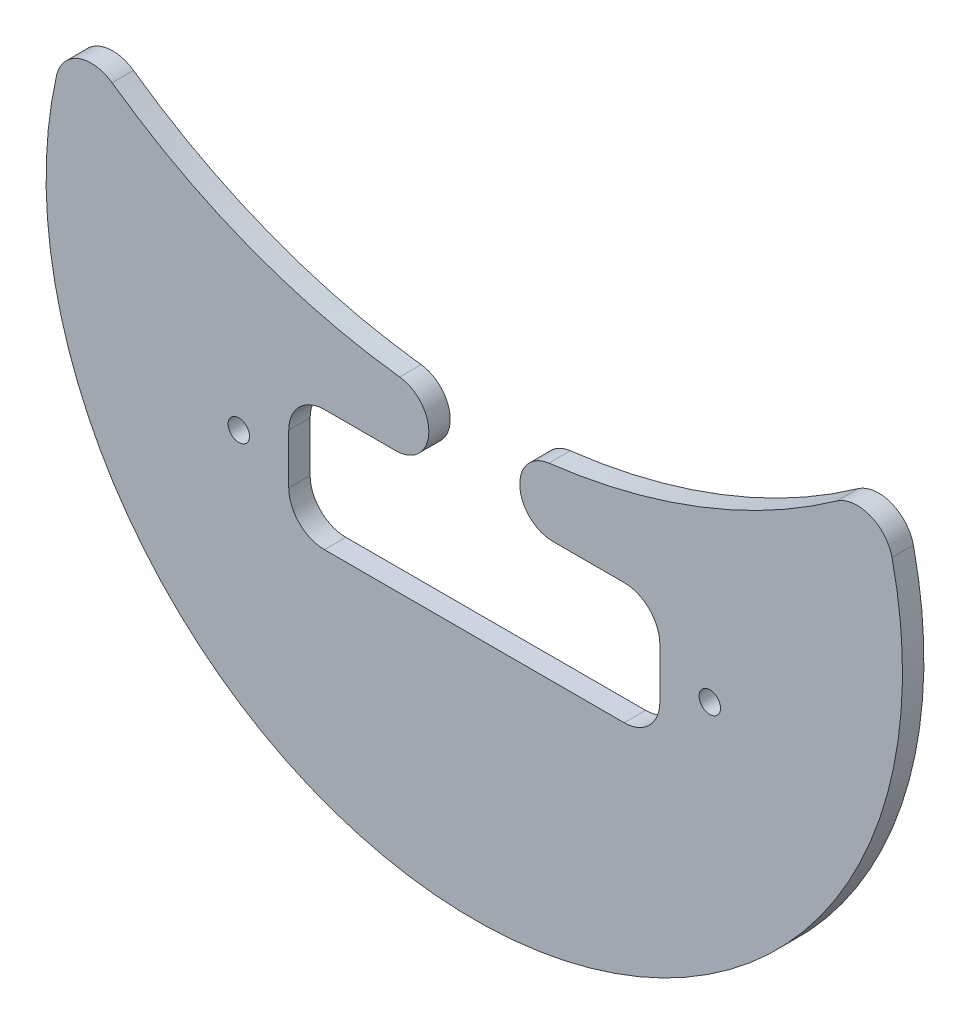
ISO-10303-21;
HEADER;
FILE_DESCRIPTION(('STEP AP214'),'2;1');
FILE_NAME('part.step','',(''),(''),'','','');
FILE_SCHEMA(('AUTOMOTIVE_DESIGN { 1 0 10303 214 1 1 1 1 }'));
ENDSEC;
DATA;
#1=APPLICATION_CONTEXT('core data for automotive mechanical design processes');
#2=APPLICATION_PROTOCOL_DEFINITION('international standard','automotive_design',2000,#1);
#3=PRODUCT_CONTEXT('',#1,'mechanical');
#4=PRODUCT('Part','Part','',(#3));
#5=PRODUCT_RELATED_PRODUCT_CATEGORY('part','',(#4));
#6=PRODUCT_DEFINITION_FORMATION('','',#4);
#7=PRODUCT_DEFINITION_CONTEXT('part definition',#1,'design');
#8=PRODUCT_DEFINITION('design','',#6,#7);
#9=PRODUCT_DEFINITION_SHAPE('','',#8);
#10=(LENGTH_UNIT() NAMED_UNIT(*) SI_UNIT(.MILLI.,.METRE.));
#11=(NAMED_UNIT(*) PLANE_ANGLE_UNIT() SI_UNIT($,.RADIAN.));
#12=(NAMED_UNIT(*) SI_UNIT($,.STERADIAN.) SOLID_ANGLE_UNIT());
#13=UNCERTAINTY_MEASURE_WITH_UNIT(LENGTH_MEASURE(1.E-05),#10,'distance_accuracy_value','');
#14=(GEOMETRIC_REPRESENTATION_CONTEXT(3) GLOBAL_UNCERTAINTY_ASSIGNED_CONTEXT((#13)) GLOBAL_UNIT_ASSIGNED_CONTEXT((#10,
#11,#12)) REPRESENTATION_CONTEXT('',''));
#15=CARTESIAN_POINT('',(0.,0.,0.));
#16=DIRECTION('',(0.,0.,1.));
#17=DIRECTION('',(1.,0.,0.));
#18=AXIS2_PLACEMENT_3D('',#15,#16,#17);
#19=CARTESIAN_POINT('',(0.151407967482101,120.064132004892,3.));
#20=DIRECTION('',(0.,0.,1.));
#21=DIRECTION('',(1.,0.,0.));
#22=AXIS2_PLACEMENT_3D('',#19,#20,#21);
#23=PLANE('',#22);
#24=CARTESIAN_POINT('',(-32.8485920325179,15.25,3.));
#25=DIRECTION('',(0.,0.,1.));
#26=DIRECTION('',(1.,0.,0.));
#27=AXIS2_PLACEMENT_3D('',#24,#25,#26);
#28=CIRCLE('',#27,1.5);
#29=CARTESIAN_POINT('',(-31.3485920325179,15.25,3.));
#30=VERTEX_POINT('',#29);
#31=EDGE_CURVE('E192',#30,#30,#28,.T.);
#32=ORIENTED_EDGE('',*,*,#31,.F.);
#33=EDGE_LOOP('',(#32));
#34=FACE_BOUND('',#33,.T.);
#35=CARTESIAN_POINT('',(0.151407967482101,120.064132004892,3.));
#36=DIRECTION('',(0.,0.,-1.));
#37=DIRECTION('',(1.,0.,0.));
#38=AXIS2_PLACEMENT_3D('',#35,#36,#37);
#39=CIRCLE('',#38,87.7141320048927);
#40=CARTESIAN_POINT('',(-10.2972090877304,32.974549648532,3.));
#41=VERTEX_POINT('',#40);
#42=CARTESIAN_POINT('',(-50.6074334631441,48.528763340208,3.));
#43=VERTEX_POINT('',#42);
#44=EDGE_CURVE('E214',#41,#43,#39,.T.);
#45=ORIENTED_EDGE('',*,*,#44,.T.);
#46=CARTESIAN_POINT('',(-53.5008578333354,44.451007166283,3.));
#47=DIRECTION('',(0.,0.,1.));
#48=DIRECTION('',(1.,0.,0.));
#49=AXIS2_PLACEMENT_3D('',#46,#47,#48);
#50=CIRCLE('',#49,5.);
#51=CARTESIAN_POINT('',(-58.3783365425006,45.5510987268542,3.));
#52=VERTEX_POINT('',#51);
#53=EDGE_CURVE('E251',#43,#52,#50,.T.);
#54=ORIENTED_EDGE('',*,*,#53,.T.);
#55=CARTESIAN_POINT('',(0.151407967482101,32.35,3.));
#56=DIRECTION('',(0.,0.,1.));
#57=DIRECTION('',(1.,0.,0.));
#58=AXIS2_PLACEMENT_3D('',#55,#56,#57);
#59=CIRCLE('',#58,60.);
#60=CARTESIAN_POINT('',(58.6811524774648,45.5510987268542,3.));
#61=VERTEX_POINT('',#60);
#62=EDGE_CURVE('E155',#52,#61,#59,.T.);
#63=ORIENTED_EDGE('',*,*,#62,.T.);
#64=CARTESIAN_POINT('',(53.8036737682996,44.451007166283,3.));
#65=DIRECTION('',(0.,0.,1.));
#66=DIRECTION('',(1.,0.,0.));
#67=AXIS2_PLACEMENT_3D('',#64,#65,#66);
#68=CIRCLE('',#67,5.);
#69=CARTESIAN_POINT('',(50.9102493981083,48.528763340208,3.));
#70=VERTEX_POINT('',#69);
#71=EDGE_CURVE('E48',#61,#70,#68,.T.);
#72=ORIENTED_EDGE('',*,*,#71,.T.);
#73=CARTESIAN_POINT('',(0.151407967482101,120.064132004892,3.));
#74=DIRECTION('',(0.,0.,-1.));
#75=DIRECTION('',(1.,0.,0.));
#76=AXIS2_PLACEMENT_3D('',#73,#74,#75);
#77=CIRCLE('',#76,87.7141320048927);
#78=CARTESIAN_POINT('',(10.6000250226946,32.9745496485319,3.));
#79=VERTEX_POINT('',#78);
#80=EDGE_CURVE('E145',#70,#79,#77,.T.);
#81=ORIENTED_EDGE('',*,*,#80,.T.);
#82=CARTESIAN_POINT('',(11.1514079674821,28.3787538483586,3.));
#83=DIRECTION('',(0.,0.,1.));
#84=DIRECTION('',(1.,0.,0.));
#85=AXIS2_PLACEMENT_3D('',#82,#83,#84);
#86=CIRCLE('',#85,4.62875384835843);
#87=CARTESIAN_POINT('',(11.1514079674821,23.7500000000002,3.));
#88=VERTEX_POINT('',#87);
#89=EDGE_CURVE('E150',#79,#88,#86,.T.);
#90=ORIENTED_EDGE('',*,*,#89,.T.);
#91=DIRECTION('',(1.,0.,0.));
#92=VECTOR('',#91,1.);
#93=CARTESIAN_POINT('',(11.1514079674821,23.75,3.));
#94=LINE('',#93,#92);
#95=CARTESIAN_POINT('',(21.1514079674821,23.75,3.));
#96=VERTEX_POINT('',#95);
#97=EDGE_CURVE('E170',#88,#96,#94,.T.);
#98=ORIENTED_EDGE('',*,*,#97,.T.);
#99=CARTESIAN_POINT('',(21.1514079674821,18.75,3.));
#100=DIRECTION('',(0.,0.,1.));
#101=DIRECTION('',(1.,0.,0.));
#102=AXIS2_PLACEMENT_3D('',#99,#100,#101);
#103=CIRCLE('',#102,5.);
#104=CARTESIAN_POINT('',(26.1514079674821,18.75,3.));
#105=VERTEX_POINT('',#104);
#106=EDGE_CURVE('E11',#96,#105,#103,.F.);
#107=ORIENTED_EDGE('',*,*,#106,.T.);
#108=DIRECTION('',(0.,-1.,0.));
#109=VECTOR('',#108,1.);
#110=CARTESIAN_POINT('',(26.1514079674821,6.74999999999999,3.));
#111=LINE('',#110,#109);
#112=CARTESIAN_POINT('',(26.1514079674821,11.75,3.));
#113=VERTEX_POINT('',#112);
#114=EDGE_CURVE('E172',#105,#113,#111,.T.);
#115=ORIENTED_EDGE('',*,*,#114,.T.);
#116=CARTESIAN_POINT('',(21.1514079674821,11.75,3.));
#117=DIRECTION('',(0.,0.,1.));
#118=DIRECTION('',(1.,0.,0.));
#119=AXIS2_PLACEMENT_3D('',#116,#117,#118);
#120=CIRCLE('',#119,5.);
#121=CARTESIAN_POINT('',(21.1514079674821,6.74999999999999,3.));
#122=VERTEX_POINT('',#121);
#123=EDGE_CURVE('E265',#113,#122,#120,.F.);
#124=ORIENTED_EDGE('',*,*,#123,.T.);
#125=DIRECTION('',(-1.,0.,0.));
#126=VECTOR('',#125,1.);
#127=CARTESIAN_POINT('',(-25.8485920325179,6.74999999999999,3.));
#128=LINE('',#127,#126);
#129=CARTESIAN_POINT('',(-20.8485920325179,6.74999999999999,3.));
#130=VERTEX_POINT('',#129);
#131=EDGE_CURVE('E178',#122,#130,#128,.T.);
#132=ORIENTED_EDGE('',*,*,#131,.T.);
#133=CARTESIAN_POINT('',(-20.8485920325179,11.75,3.));
#134=DIRECTION('',(0.,0.,1.));
#135=DIRECTION('',(1.,0.,0.));
#136=AXIS2_PLACEMENT_3D('',#133,#134,#135);
#137=CIRCLE('',#136,5.);
#138=CARTESIAN_POINT('',(-25.8485920325179,11.75,3.));
#139=VERTEX_POINT('',#138);
#140=EDGE_CURVE('E261',#130,#139,#137,.F.);
#141=ORIENTED_EDGE('',*,*,#140,.T.);
#142=DIRECTION('',(0.,1.,0.));
#143=VECTOR('',#142,1.);
#144=CARTESIAN_POINT('',(-25.8485920325179,6.74999999999999,3.));
#145=LINE('',#144,#143);
#146=CARTESIAN_POINT('',(-25.8485920325179,18.75,3.));
#147=VERTEX_POINT('',#146);
#148=EDGE_CURVE('E181',#139,#147,#145,.T.);
#149=ORIENTED_EDGE('',*,*,#148,.T.);
#150=CARTESIAN_POINT('',(-20.8485920325179,18.75,3.));
#151=DIRECTION('',(0.,0.,1.));
#152=DIRECTION('',(1.,0.,0.));
#153=AXIS2_PLACEMENT_3D('',#150,#151,#152);
#154=CIRCLE('',#153,5.);
#155=CARTESIAN_POINT('',(-20.8485920325179,23.75,3.));
#156=VERTEX_POINT('',#155);
#157=EDGE_CURVE('E257',#147,#156,#154,.F.);
#158=ORIENTED_EDGE('',*,*,#157,.T.);
#159=DIRECTION('',(1.,0.,0.));
#160=VECTOR('',#159,1.);
#161=CARTESIAN_POINT('',(-25.8485920325179,23.75,3.));
#162=LINE('',#161,#160);
#163=CARTESIAN_POINT('',(-10.8485920325179,23.75,3.));
#164=VERTEX_POINT('',#163);
#165=EDGE_CURVE('E184',#156,#164,#162,.T.);
#166=ORIENTED_EDGE('',*,*,#165,.T.);
#167=CARTESIAN_POINT('',(-10.8485920325179,28.3787538483587,3.));
#168=DIRECTION('',(0.,0.,1.));
#169=DIRECTION('',(-1.,0.,0.));
#170=AXIS2_PLACEMENT_3D('',#167,#168,#169);
#171=CIRCLE('',#170,4.62875384835843);
#172=EDGE_CURVE('E186',#164,#41,#171,.T.);
#173=ORIENTED_EDGE('',*,*,#172,.T.);
#174=EDGE_LOOP('',(#45,#54,#63,#72,#81,#90,#98,#107,#115,#124,#132,#141,#149,#158,#166,#173));
#175=FACE_BOUND('',#174,.T.);
#176=CARTESIAN_POINT('',(33.1514079674821,15.25,3.));
#177=DIRECTION('',(0.,0.,1.));
#178=DIRECTION('',(1.,0.,0.));
#179=AXIS2_PLACEMENT_3D('',#176,#177,#178);
#180=CIRCLE('',#179,1.5);
#181=CARTESIAN_POINT('',(34.6514079674821,15.25,3.));
#182=VERTEX_POINT('',#181);
#183=EDGE_CURVE('E330',#182,#182,#180,.T.);
#184=ORIENTED_EDGE('',*,*,#183,.F.);
#185=EDGE_LOOP('',(#184));
#186=FACE_BOUND('',#185,.T.);
#187=ADVANCED_FACE('F33',(#34,#175,#186),#23,.T.);
#188=CARTESIAN_POINT('',(0.151407967482101,120.064132004892,0.));
#189=DIRECTION('',(0.,0.,1.));
#190=DIRECTION('',(1.,0.,0.));
#191=AXIS2_PLACEMENT_3D('',#188,#189,#190);
#192=PLANE('',#191);
#193=CARTESIAN_POINT('',(0.151407967482101,32.35,0.));
#194=DIRECTION('',(0.,0.,1.));
#195=DIRECTION('',(1.,0.,0.));
#196=AXIS2_PLACEMENT_3D('',#193,#194,#195);
#197=CIRCLE('',#196,60.);
#198=CARTESIAN_POINT('',(-58.3783365425006,45.5510987268542,0.));
#199=VERTEX_POINT('',#198);
#200=CARTESIAN_POINT('',(58.6811524774648,45.5510987268542,0.));
#201=VERTEX_POINT('',#200);
#202=EDGE_CURVE('E191',#199,#201,#197,.T.);
#203=ORIENTED_EDGE('',*,*,#202,.F.);
#204=CARTESIAN_POINT('',(-53.5008578333354,44.451007166283,0.));
#205=DIRECTION('',(0.,0.,1.));
#206=DIRECTION('',(1.,0.,0.));
#207=AXIS2_PLACEMENT_3D('',#204,#205,#206);
#208=CIRCLE('',#207,5.);
#209=CARTESIAN_POINT('',(-50.6074334631441,48.528763340208,0.));
#210=VERTEX_POINT('',#209);
#211=EDGE_CURVE('E247',#199,#210,#208,.F.);
#212=ORIENTED_EDGE('',*,*,#211,.T.);
#213=CARTESIAN_POINT('',(0.151407967482101,120.064132004892,0.));
#214=DIRECTION('',(0.,0.,-1.));
#215=DIRECTION('',(1.,0.,0.));
#216=AXIS2_PLACEMENT_3D('',#213,#214,#215);
#217=CIRCLE('',#216,87.7141320048927);
#218=CARTESIAN_POINT('',(-10.2972090877304,32.974549648532,0.));
#219=VERTEX_POINT('',#218);
#220=EDGE_CURVE('E189',#219,#210,#217,.T.);
#221=ORIENTED_EDGE('',*,*,#220,.F.);
#222=CARTESIAN_POINT('',(-10.8485920325179,28.3787538483587,0.));
#223=DIRECTION('',(0.,0.,1.));
#224=DIRECTION('',(-1.,0.,0.));
#225=AXIS2_PLACEMENT_3D('',#222,#223,#224);
#226=CIRCLE('',#225,4.62875384835843);
#227=CARTESIAN_POINT('',(-10.8485920325179,23.75,0.));
#228=VERTEX_POINT('',#227);
#229=EDGE_CURVE('E212',#228,#219,#226,.T.);
#230=ORIENTED_EDGE('',*,*,#229,.F.);
#231=DIRECTION('',(1.,0.,0.));
#232=VECTOR('',#231,1.);
#233=CARTESIAN_POINT('',(-25.8485920325179,23.75,0.));
#234=LINE('',#233,#232);
#235=CARTESIAN_POINT('',(-20.8485920325179,23.75,0.));
#236=VERTEX_POINT('',#235);
#237=EDGE_CURVE('E210',#236,#228,#234,.T.);
#238=ORIENTED_EDGE('',*,*,#237,.F.);
#239=CARTESIAN_POINT('',(-20.8485920325179,18.75,0.));
#240=DIRECTION('',(0.,0.,1.));
#241=DIRECTION('',(1.,0.,0.));
#242=AXIS2_PLACEMENT_3D('',#239,#240,#241);
#243=CIRCLE('',#242,5.);
#244=CARTESIAN_POINT('',(-25.8485920325179,18.75,0.));
#245=VERTEX_POINT('',#244);
#246=EDGE_CURVE('E255',#236,#245,#243,.T.);
#247=ORIENTED_EDGE('',*,*,#246,.T.);
#248=DIRECTION('',(0.,1.,0.));
#249=VECTOR('',#248,1.);
#250=CARTESIAN_POINT('',(-25.8485920325179,6.74999999999999,0.));
#251=LINE('',#250,#249);
#252=CARTESIAN_POINT('',(-25.8485920325179,11.75,0.));
#253=VERTEX_POINT('',#252);
#254=EDGE_CURVE('E207',#253,#245,#251,.T.);
#255=ORIENTED_EDGE('',*,*,#254,.F.);
#256=CARTESIAN_POINT('',(-20.8485920325179,11.75,0.));
#257=DIRECTION('',(0.,0.,1.));
#258=DIRECTION('',(1.,0.,0.));
#259=AXIS2_PLACEMENT_3D('',#256,#257,#258);
#260=CIRCLE('',#259,5.);
#261=CARTESIAN_POINT('',(-20.8485920325179,6.74999999999999,0.));
#262=VERTEX_POINT('',#261);
#263=EDGE_CURVE('E259',#253,#262,#260,.T.);
#264=ORIENTED_EDGE('',*,*,#263,.T.);
#265=DIRECTION('',(-1.,0.,0.));
#266=VECTOR('',#265,1.);
#267=CARTESIAN_POINT('',(-25.8485920325179,6.74999999999999,0.));
#268=LINE('',#267,#266);
#269=CARTESIAN_POINT('',(21.1514079674821,6.74999999999999,0.));
#270=VERTEX_POINT('',#269);
#271=EDGE_CURVE('E204',#270,#262,#268,.T.);
#272=ORIENTED_EDGE('',*,*,#271,.F.);
#273=CARTESIAN_POINT('',(21.1514079674821,11.75,0.));
#274=DIRECTION('',(0.,0.,1.));
#275=DIRECTION('',(1.,0.,0.));
#276=AXIS2_PLACEMENT_3D('',#273,#274,#275);
#277=CIRCLE('',#276,5.);
#278=CARTESIAN_POINT('',(26.1514079674821,11.75,0.));
#279=VERTEX_POINT('',#278);
#280=EDGE_CURVE('E263',#270,#279,#277,.T.);
#281=ORIENTED_EDGE('',*,*,#280,.T.);
#282=DIRECTION('',(0.,-1.,0.));
#283=VECTOR('',#282,1.);
#284=CARTESIAN_POINT('',(26.1514079674821,6.74999999999999,0.));
#285=LINE('',#284,#283);
#286=CARTESIAN_POINT('',(26.1514079674821,18.75,0.));
#287=VERTEX_POINT('',#286);
#288=EDGE_CURVE('E201',#287,#279,#285,.T.);
#289=ORIENTED_EDGE('',*,*,#288,.F.);
#290=CARTESIAN_POINT('',(21.1514079674821,18.75,0.));
#291=DIRECTION('',(0.,0.,1.));
#292=DIRECTION('',(1.,0.,0.));
#293=AXIS2_PLACEMENT_3D('',#290,#291,#292);
#294=CIRCLE('',#293,5.);
#295=CARTESIAN_POINT('',(21.1514079674821,23.75,0.));
#296=VERTEX_POINT('',#295);
#297=EDGE_CURVE('E41',#287,#296,#294,.T.);
#298=ORIENTED_EDGE('',*,*,#297,.T.);
#299=DIRECTION('',(1.,0.,0.));
#300=VECTOR('',#299,1.);
#301=CARTESIAN_POINT('',(11.1514079674821,23.75,0.));
#302=LINE('',#301,#300);
#303=CARTESIAN_POINT('',(11.1514079674821,23.7500000000002,0.));
#304=VERTEX_POINT('',#303);
#305=EDGE_CURVE('E198',#304,#296,#302,.T.);
#306=ORIENTED_EDGE('',*,*,#305,.F.);
#307=CARTESIAN_POINT('',(11.1514079674821,28.3787538483586,0.));
#308=DIRECTION('',(0.,0.,1.));
#309=DIRECTION('',(1.,0.,0.));
#310=AXIS2_PLACEMENT_3D('',#307,#308,#309);
#311=CIRCLE('',#310,4.62875384835843);
#312=CARTESIAN_POINT('',(10.6000250226946,32.9745496485319,0.));
#313=VERTEX_POINT('',#312);
#314=EDGE_CURVE('E196',#313,#304,#311,.T.);
#315=ORIENTED_EDGE('',*,*,#314,.F.);
#316=CARTESIAN_POINT('',(0.151407967482101,120.064132004892,0.));
#317=DIRECTION('',(0.,0.,-1.));
#318=DIRECTION('',(1.,0.,0.));
#319=AXIS2_PLACEMENT_3D('',#316,#317,#318);
#320=CIRCLE('',#319,87.7141320048927);
#321=CARTESIAN_POINT('',(50.9102493981083,48.528763340208,0.));
#322=VERTEX_POINT('',#321);
#323=EDGE_CURVE('E161',#322,#313,#320,.T.);
#324=ORIENTED_EDGE('',*,*,#323,.F.);
#325=CARTESIAN_POINT('',(53.8036737682996,44.451007166283,0.));
#326=DIRECTION('',(0.,0.,1.));
#327=DIRECTION('',(1.,0.,0.));
#328=AXIS2_PLACEMENT_3D('',#325,#326,#327);
#329=CIRCLE('',#328,5.);
#330=EDGE_CURVE('E245',#322,#201,#329,.F.);
#331=ORIENTED_EDGE('',*,*,#330,.T.);
#332=EDGE_LOOP('',(#203,#212,#221,#230,#238,#247,#255,#264,#272,#281,#289,#298,#306,#315,#324,#331));
#333=FACE_BOUND('',#332,.T.);
#334=CARTESIAN_POINT('',(-32.8485920325179,15.25,0.));
#335=DIRECTION('',(0.,0.,1.));
#336=DIRECTION('',(1.,0.,0.));
#337=AXIS2_PLACEMENT_3D('',#334,#335,#336);
#338=CIRCLE('',#337,1.5);
#339=CARTESIAN_POINT('',(-31.3485920325179,15.25,0.));
#340=VERTEX_POINT('',#339);
#341=EDGE_CURVE('E327',#340,#340,#338,.T.);
#342=ORIENTED_EDGE('',*,*,#341,.T.);
#343=EDGE_LOOP('',(#342));
#344=FACE_BOUND('',#343,.T.);
#345=CARTESIAN_POINT('',(33.1514079674821,15.25,0.));
#346=DIRECTION('',(0.,0.,1.));
#347=DIRECTION('',(1.,0.,0.));
#348=AXIS2_PLACEMENT_3D('',#345,#346,#347);
#349=CIRCLE('',#348,1.5);
#350=CARTESIAN_POINT('',(34.6514079674821,15.25,0.));
#351=VERTEX_POINT('',#350);
#352=EDGE_CURVE('E333',#351,#351,#349,.T.);
#353=ORIENTED_EDGE('',*,*,#352,.T.);
#354=EDGE_LOOP('',(#353));
#355=FACE_BOUND('',#354,.T.);
#356=ADVANCED_FACE('F270',(#333,#344,#355),#192,.F.);
#357=CARTESIAN_POINT('',(0.151407967482101,120.064132004892,3.));
#358=DIRECTION('',(0.,0.,-1.));
#359=DIRECTION('',(-1.,0.,0.));
#360=AXIS2_PLACEMENT_3D('',#357,#358,#359);
#361=CYLINDRICAL_SURFACE('',#360,87.7141320048927);
#362=ORIENTED_EDGE('',*,*,#220,.T.);
#363=DIRECTION('',(0.,0.,-1.));
#364=VECTOR('',#363,1.);
#365=CARTESIAN_POINT('',(-50.6074334631441,48.528763340208,3.));
#366=LINE('',#365,#364);
#367=EDGE_CURVE('E56',#210,#43,#366,.F.);
#368=ORIENTED_EDGE('',*,*,#367,.T.);
#369=ORIENTED_EDGE('',*,*,#44,.F.);
#370=DIRECTION('',(0.,0.,-1.));
#371=VECTOR('',#370,1.);
#372=CARTESIAN_POINT('',(-10.2972090877304,32.974549648532,3.));
#373=LINE('',#372,#371);
#374=EDGE_CURVE('E188',#41,#219,#373,.T.);
#375=ORIENTED_EDGE('',*,*,#374,.T.);
#376=EDGE_LOOP('',(#362,#368,#369,#375));
#377=FACE_BOUND('',#376,.T.);
#378=ADVANCED_FACE('F347',(#377),#361,.F.);
#379=CARTESIAN_POINT('',(0.151407967482101,32.35,3.));
#380=DIRECTION('',(0.,0.,-1.));
#381=DIRECTION('',(-1.,0.,0.));
#382=AXIS2_PLACEMENT_3D('',#379,#380,#381);
#383=CYLINDRICAL_SURFACE('',#382,60.);
#384=ORIENTED_EDGE('',*,*,#62,.F.);
#385=DIRECTION('',(0.,0.,-1.));
#386=VECTOR('',#385,1.);
#387=CARTESIAN_POINT('',(-58.3783365425006,45.5510987268542,3.));
#388=LINE('',#387,#386);
#389=EDGE_CURVE('E242',#52,#199,#388,.T.);
#390=ORIENTED_EDGE('',*,*,#389,.T.);
#391=ORIENTED_EDGE('',*,*,#202,.T.);
#392=DIRECTION('',(0.,0.,-1.));
#393=VECTOR('',#392,1.);
#394=CARTESIAN_POINT('',(58.6811524774648,45.5510987268542,3.));
#395=LINE('',#394,#393);
#396=EDGE_CURVE('E240',#201,#61,#395,.F.);
#397=ORIENTED_EDGE('',*,*,#396,.T.);
#398=EDGE_LOOP('',(#384,#390,#391,#397));
#399=FACE_BOUND('',#398,.T.);
#400=ADVANCED_FACE('F322',(#399),#383,.T.);
#401=CARTESIAN_POINT('',(0.151407967482101,120.064132004892,3.));
#402=DIRECTION('',(0.,0.,-1.));
#403=DIRECTION('',(-1.,0.,0.));
#404=AXIS2_PLACEMENT_3D('',#401,#402,#403);
#405=CYLINDRICAL_SURFACE('',#404,87.7141320048927);
#406=ORIENTED_EDGE('',*,*,#80,.F.);
#407=DIRECTION('',(0.,0.,-1.));
#408=VECTOR('',#407,1.);
#409=CARTESIAN_POINT('',(50.9102493981083,48.528763340208,3.));
#410=LINE('',#409,#408);
#411=EDGE_CURVE('E253',#70,#322,#410,.T.);
#412=ORIENTED_EDGE('',*,*,#411,.T.);
#413=ORIENTED_EDGE('',*,*,#323,.T.);
#414=DIRECTION('',(0.,0.,-1.));
#415=VECTOR('',#414,1.);
#416=CARTESIAN_POINT('',(10.6000250226946,32.9745496485319,3.));
#417=LINE('',#416,#415);
#418=EDGE_CURVE('E158',#79,#313,#417,.T.);
#419=ORIENTED_EDGE('',*,*,#418,.F.);
#420=EDGE_LOOP('',(#406,#412,#413,#419));
#421=FACE_BOUND('',#420,.T.);
#422=ADVANCED_FACE('F159',(#421),#405,.F.);
#423=CARTESIAN_POINT('',(11.1514079674821,28.3787538483586,3.));
#424=DIRECTION('',(0.,0.,-1.));
#425=DIRECTION('',(-1.,0.,0.));
#426=AXIS2_PLACEMENT_3D('',#423,#424,#425);
#427=CYLINDRICAL_SURFACE('',#426,4.62875384835843);
#428=ORIENTED_EDGE('',*,*,#314,.T.);
#429=DIRECTION('',(0.,0.,-1.));
#430=VECTOR('',#429,1.);
#431=CARTESIAN_POINT('',(11.1514079674821,23.7500000000002,3.));
#432=LINE('',#431,#430);
#433=EDGE_CURVE('E165',#88,#304,#432,.T.);
#434=ORIENTED_EDGE('',*,*,#433,.F.);
#435=ORIENTED_EDGE('',*,*,#89,.F.);
#436=ORIENTED_EDGE('',*,*,#418,.T.);
#437=EDGE_LOOP('',(#428,#434,#435,#436));
#438=FACE_BOUND('',#437,.T.);
#439=ADVANCED_FACE('F167',(#438),#427,.T.);
#440=CARTESIAN_POINT('',(11.1514079674821,23.75,3.));
#441=DIRECTION('',(0.,1.,0.));
#442=DIRECTION('',(0.,0.,1.));
#443=AXIS2_PLACEMENT_3D('',#440,#441,#442);
#444=PLANE('',#443);
#445=ORIENTED_EDGE('',*,*,#305,.T.);
#446=DIRECTION('',(0.,0.,-1.));
#447=VECTOR('',#446,1.);
#448=CARTESIAN_POINT('',(21.1514079674821,23.75,3.));
#449=LINE('',#448,#447);
#450=EDGE_CURVE('E238',#296,#96,#449,.F.);
#451=ORIENTED_EDGE('',*,*,#450,.T.);
#452=ORIENTED_EDGE('',*,*,#97,.F.);
#453=ORIENTED_EDGE('',*,*,#433,.T.);
#454=EDGE_LOOP('',(#445,#451,#452,#453));
#455=FACE_BOUND('',#454,.T.);
#456=ADVANCED_FACE('F276',(#455),#444,.F.);
#457=CARTESIAN_POINT('',(26.1514079674821,6.74999999999999,3.));
#458=DIRECTION('',(1.,0.,0.));
#459=DIRECTION('',(0.,0.,-1.));
#460=AXIS2_PLACEMENT_3D('',#457,#458,#459);
#461=PLANE('',#460);
#462=ORIENTED_EDGE('',*,*,#288,.T.);
#463=DIRECTION('',(0.,0.,-1.));
#464=VECTOR('',#463,1.);
#465=CARTESIAN_POINT('',(26.1514079674821,11.75,3.));
#466=LINE('',#465,#464);
#467=EDGE_CURVE('E236',#279,#113,#466,.F.);
#468=ORIENTED_EDGE('',*,*,#467,.T.);
#469=ORIENTED_EDGE('',*,*,#114,.F.);
#470=DIRECTION('',(0.,0.,-1.));
#471=VECTOR('',#470,1.);
#472=CARTESIAN_POINT('',(26.1514079674821,18.75,0.));
#473=LINE('',#472,#471);
#474=EDGE_CURVE('E233',#105,#287,#473,.T.);
#475=ORIENTED_EDGE('',*,*,#474,.T.);
#476=EDGE_LOOP('',(#462,#468,#469,#475));
#477=FACE_BOUND('',#476,.T.);
#478=ADVANCED_FACE('F282',(#477),#461,.F.);
#479=CARTESIAN_POINT('',(-25.8485920325179,6.74999999999999,3.));
#480=DIRECTION('',(0.,-1.,0.));
#481=DIRECTION('',(0.,0.,-1.));
#482=AXIS2_PLACEMENT_3D('',#479,#480,#481);
#483=PLANE('',#482);
#484=ORIENTED_EDGE('',*,*,#271,.T.);
#485=DIRECTION('',(0.,0.,-1.));
#486=VECTOR('',#485,1.);
#487=CARTESIAN_POINT('',(-20.8485920325179,6.74999999999999,3.));
#488=LINE('',#487,#486);
#489=EDGE_CURVE('E231',#262,#130,#488,.F.);
#490=ORIENTED_EDGE('',*,*,#489,.T.);
#491=ORIENTED_EDGE('',*,*,#131,.F.);
#492=DIRECTION('',(0.,0.,-1.));
#493=VECTOR('',#492,1.);
#494=CARTESIAN_POINT('',(21.1514079674821,6.74999999999999,0.));
#495=LINE('',#494,#493);
#496=EDGE_CURVE('E228',#122,#270,#495,.T.);
#497=ORIENTED_EDGE('',*,*,#496,.T.);
#498=EDGE_LOOP('',(#484,#490,#491,#497));
#499=FACE_BOUND('',#498,.T.);
#500=ADVANCED_FACE('F290',(#499),#483,.F.);
#501=CARTESIAN_POINT('',(-25.8485920325179,6.74999999999999,3.));
#502=DIRECTION('',(-1.,0.,0.));
#503=DIRECTION('',(0.,0.,1.));
#504=AXIS2_PLACEMENT_3D('',#501,#502,#503);
#505=PLANE('',#504);
#506=ORIENTED_EDGE('',*,*,#254,.T.);
#507=DIRECTION('',(0.,0.,-1.));
#508=VECTOR('',#507,1.);
#509=CARTESIAN_POINT('',(-25.8485920325179,18.75,3.));
#510=LINE('',#509,#508);
#511=EDGE_CURVE('E226',#245,#147,#510,.F.);
#512=ORIENTED_EDGE('',*,*,#511,.T.);
#513=ORIENTED_EDGE('',*,*,#148,.F.);
#514=DIRECTION('',(0.,0.,-1.));
#515=VECTOR('',#514,1.);
#516=CARTESIAN_POINT('',(-25.8485920325179,11.75,0.));
#517=LINE('',#516,#515);
#518=EDGE_CURVE('E223',#139,#253,#517,.T.);
#519=ORIENTED_EDGE('',*,*,#518,.T.);
#520=EDGE_LOOP('',(#506,#512,#513,#519));
#521=FACE_BOUND('',#520,.T.);
#522=ADVANCED_FACE('F299',(#521),#505,.F.);
#523=CARTESIAN_POINT('',(-25.8485920325179,23.75,3.));
#524=DIRECTION('',(0.,1.,0.));
#525=DIRECTION('',(0.,0.,1.));
#526=AXIS2_PLACEMENT_3D('',#523,#524,#525);
#527=PLANE('',#526);
#528=ORIENTED_EDGE('',*,*,#165,.F.);
#529=DIRECTION('',(0.,0.,-1.));
#530=VECTOR('',#529,1.);
#531=CARTESIAN_POINT('',(-20.8485920325179,23.75,0.));
#532=LINE('',#531,#530);
#533=EDGE_CURVE('E164',#156,#236,#532,.T.);
#534=ORIENTED_EDGE('',*,*,#533,.T.);
#535=ORIENTED_EDGE('',*,*,#237,.T.);
#536=DIRECTION('',(0.,0.,-1.));
#537=VECTOR('',#536,1.);
#538=CARTESIAN_POINT('',(-10.8485920325179,23.75,3.));
#539=LINE('',#538,#537);
#540=EDGE_CURVE('E217',#164,#228,#539,.T.);
#541=ORIENTED_EDGE('',*,*,#540,.F.);
#542=EDGE_LOOP('',(#528,#534,#535,#541));
#543=FACE_BOUND('',#542,.T.);
#544=ADVANCED_FACE('F308',(#543),#527,.F.);
#545=CARTESIAN_POINT('',(-10.8485920325179,28.3787538483587,3.));
#546=DIRECTION('',(0.,0.,-1.));
#547=DIRECTION('',(-1.,0.,0.));
#548=AXIS2_PLACEMENT_3D('',#545,#546,#547);
#549=CYLINDRICAL_SURFACE('',#548,4.62875384835843);
#550=ORIENTED_EDGE('',*,*,#229,.T.);
#551=ORIENTED_EDGE('',*,*,#374,.F.);
#552=ORIENTED_EDGE('',*,*,#172,.F.);
#553=ORIENTED_EDGE('',*,*,#540,.T.);
#554=EDGE_LOOP('',(#550,#551,#552,#553));
#555=FACE_BOUND('',#554,.T.);
#556=ADVANCED_FACE('F314',(#555),#549,.T.);
#557=CARTESIAN_POINT('',(-32.8485920325179,15.25,3.));
#558=DIRECTION('',(0.,0.,-1.));
#559=DIRECTION('',(-1.,0.,0.));
#560=AXIS2_PLACEMENT_3D('',#557,#558,#559);
#561=CYLINDRICAL_SURFACE('',#560,1.5);
#562=ORIENTED_EDGE('',*,*,#31,.T.);
#563=EDGE_LOOP('',(#562));
#564=FACE_BOUND('',#563,.T.);
#565=ORIENTED_EDGE('',*,*,#341,.F.);
#566=EDGE_LOOP('',(#565));
#567=FACE_BOUND('',#566,.T.);
#568=ADVANCED_FACE('F351',(#564,#567),#561,.F.);
#569=CARTESIAN_POINT('',(33.1514079674821,15.25,3.));
#570=DIRECTION('',(0.,0.,-1.));
#571=DIRECTION('',(-1.,0.,0.));
#572=AXIS2_PLACEMENT_3D('',#569,#570,#571);
#573=CYLINDRICAL_SURFACE('',#572,1.5);
#574=ORIENTED_EDGE('',*,*,#183,.T.);
#575=EDGE_LOOP('',(#574));
#576=FACE_BOUND('',#575,.T.);
#577=ORIENTED_EDGE('',*,*,#352,.F.);
#578=EDGE_LOOP('',(#577));
#579=FACE_BOUND('',#578,.T.);
#580=ADVANCED_FACE('F339',(#576,#579),#573,.F.);
#581=CARTESIAN_POINT('',(-20.8485920325179,18.75,3.));
#582=DIRECTION('',(0.,0.,1.));
#583=DIRECTION('',(1.,0.,0.));
#584=AXIS2_PLACEMENT_3D('',#581,#582,#583);
#585=CYLINDRICAL_SURFACE('',#584,5.);
#586=ORIENTED_EDGE('',*,*,#157,.F.);
#587=ORIENTED_EDGE('',*,*,#511,.F.);
#588=ORIENTED_EDGE('',*,*,#246,.F.);
#589=ORIENTED_EDGE('',*,*,#533,.F.);
#590=EDGE_LOOP('',(#586,#587,#588,#589));
#591=FACE_BOUND('',#590,.T.);
#592=ADVANCED_FACE('F303',(#591),#585,.F.);
#593=CARTESIAN_POINT('',(-20.8485920325179,11.75,3.));
#594=DIRECTION('',(0.,0.,1.));
#595=DIRECTION('',(1.,0.,0.));
#596=AXIS2_PLACEMENT_3D('',#593,#594,#595);
#597=CYLINDRICAL_SURFACE('',#596,5.);
#598=ORIENTED_EDGE('',*,*,#140,.F.);
#599=ORIENTED_EDGE('',*,*,#489,.F.);
#600=ORIENTED_EDGE('',*,*,#263,.F.);
#601=ORIENTED_EDGE('',*,*,#518,.F.);
#602=EDGE_LOOP('',(#598,#599,#600,#601));
#603=FACE_BOUND('',#602,.T.);
#604=ADVANCED_FACE('F294',(#603),#597,.F.);
#605=CARTESIAN_POINT('',(21.1514079674821,11.75,3.));
#606=DIRECTION('',(0.,0.,1.));
#607=DIRECTION('',(1.,0.,0.));
#608=AXIS2_PLACEMENT_3D('',#605,#606,#607);
#609=CYLINDRICAL_SURFACE('',#608,5.);
#610=ORIENTED_EDGE('',*,*,#123,.F.);
#611=ORIENTED_EDGE('',*,*,#467,.F.);
#612=ORIENTED_EDGE('',*,*,#280,.F.);
#613=ORIENTED_EDGE('',*,*,#496,.F.);
#614=EDGE_LOOP('',(#610,#611,#612,#613));
#615=FACE_BOUND('',#614,.T.);
#616=ADVANCED_FACE('F285',(#615),#609,.F.);
#617=CARTESIAN_POINT('',(21.1514079674821,18.75,3.));
#618=DIRECTION('',(0.,0.,1.));
#619=DIRECTION('',(1.,0.,0.));
#620=AXIS2_PLACEMENT_3D('',#617,#618,#619);
#621=CYLINDRICAL_SURFACE('',#620,5.);
#622=ORIENTED_EDGE('',*,*,#106,.F.);
#623=ORIENTED_EDGE('',*,*,#450,.F.);
#624=ORIENTED_EDGE('',*,*,#297,.F.);
#625=ORIENTED_EDGE('',*,*,#474,.F.);
#626=EDGE_LOOP('',(#622,#623,#624,#625));
#627=FACE_BOUND('',#626,.T.);
#628=ADVANCED_FACE('F278',(#627),#621,.F.);
#629=CARTESIAN_POINT('',(-53.5008578333354,44.451007166283,3.));
#630=DIRECTION('',(0.,0.,1.));
#631=DIRECTION('',(1.,0.,0.));
#632=AXIS2_PLACEMENT_3D('',#629,#630,#631);
#633=CYLINDRICAL_SURFACE('',#632,5.);
#634=ORIENTED_EDGE('',*,*,#53,.F.);
#635=ORIENTED_EDGE('',*,*,#367,.F.);
#636=ORIENTED_EDGE('',*,*,#211,.F.);
#637=ORIENTED_EDGE('',*,*,#389,.F.);
#638=EDGE_LOOP('',(#634,#635,#636,#637));
#639=FACE_BOUND('',#638,.T.);
#640=ADVANCED_FACE('F320',(#639),#633,.T.);
#641=CARTESIAN_POINT('',(53.8036737682996,44.451007166283,3.));
#642=DIRECTION('',(0.,0.,1.));
#643=DIRECTION('',(1.,0.,0.));
#644=AXIS2_PLACEMENT_3D('',#641,#642,#643);
#645=CYLINDRICAL_SURFACE('',#644,5.);
#646=ORIENTED_EDGE('',*,*,#71,.F.);
#647=ORIENTED_EDGE('',*,*,#396,.F.);
#648=ORIENTED_EDGE('',*,*,#330,.F.);
#649=ORIENTED_EDGE('',*,*,#411,.F.);
#650=EDGE_LOOP('',(#646,#647,#648,#649));
#651=FACE_BOUND('',#650,.T.);
#652=ADVANCED_FACE('F35',(#651),#645,.T.);
#653=CLOSED_SHELL('',(#187,#356,#378,#400,#422,#439,#456,#478,#500,#522,#544,#556,#568,#580,
#592,#604,#616,#628,#640,#652));
#654=MANIFOLD_SOLID_BREP('B2',#653);
#655=ADVANCED_BREP_SHAPE_REPRESENTATION('',(#18,#654),#14);
#656=SHAPE_DEFINITION_REPRESENTATION(#9,#655);
ENDSEC;
END-ISO-10303-21;
